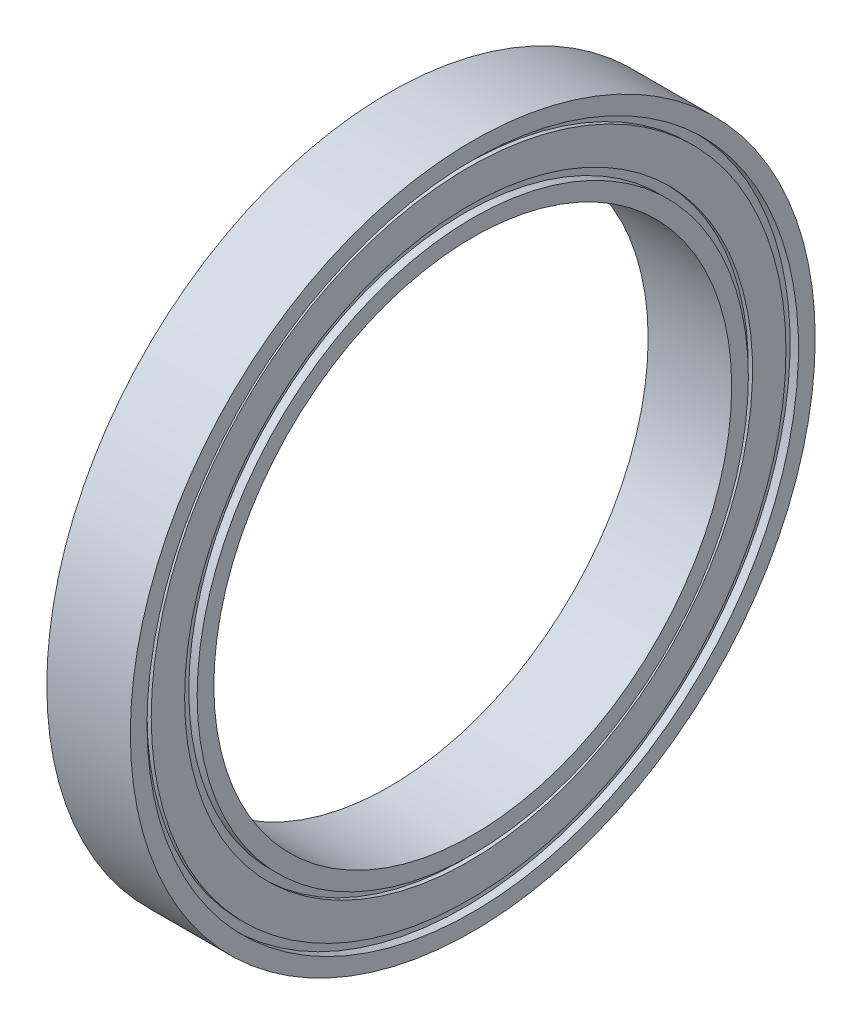
ISO-10303-21;
HEADER;
FILE_DESCRIPTION(('STEP AP214'),'2;1');
FILE_NAME('part.step','',(''),(''),'','','');
FILE_SCHEMA(('AUTOMOTIVE_DESIGN { 1 0 10303 214 1 1 1 1 }'));
ENDSEC;
DATA;
#1=APPLICATION_CONTEXT('core data for automotive mechanical design processes');
#2=APPLICATION_PROTOCOL_DEFINITION('international standard','automotive_design',2000,#1);
#3=PRODUCT_CONTEXT('',#1,'mechanical');
#4=PRODUCT('Part','Part','',(#3));
#5=PRODUCT_RELATED_PRODUCT_CATEGORY('part','',(#4));
#6=PRODUCT_DEFINITION_FORMATION('','',#4);
#7=PRODUCT_DEFINITION_CONTEXT('part definition',#1,'design');
#8=PRODUCT_DEFINITION('design','',#6,#7);
#9=PRODUCT_DEFINITION_SHAPE('','',#8);
#10=(LENGTH_UNIT() NAMED_UNIT(*) SI_UNIT(.MILLI.,.METRE.));
#11=(NAMED_UNIT(*) PLANE_ANGLE_UNIT() SI_UNIT($,.RADIAN.));
#12=(NAMED_UNIT(*) SI_UNIT($,.STERADIAN.) SOLID_ANGLE_UNIT());
#13=UNCERTAINTY_MEASURE_WITH_UNIT(LENGTH_MEASURE(1.E-05),#10,'distance_accuracy_value','');
#14=(GEOMETRIC_REPRESENTATION_CONTEXT(3) GLOBAL_UNCERTAINTY_ASSIGNED_CONTEXT((#13)) GLOBAL_UNIT_ASSIGNED_CONTEXT((#10,
#11,#12)) REPRESENTATION_CONTEXT('',''));
#15=CARTESIAN_POINT('',(0.,0.,0.));
#16=DIRECTION('',(0.,0.,1.));
#17=DIRECTION('',(1.,0.,0.));
#18=AXIS2_PLACEMENT_3D('',#15,#16,#17);
#19=CARTESIAN_POINT('',(4.,39.,0.));
#20=DIRECTION('',(-1.,0.,0.));
#21=DIRECTION('',(0.,0.,1.));
#22=AXIS2_PLACEMENT_3D('',#19,#20,#21);
#23=PLANE('',#22);
#24=CARTESIAN_POINT('',(4.,0.,0.));
#25=DIRECTION('',(-1.,0.,0.));
#26=DIRECTION('',(0.,0.,1.));
#27=AXIS2_PLACEMENT_3D('',#24,#25,#26);
#28=CIRCLE('',#27,39.);
#29=CARTESIAN_POINT('',(4.,0.,39.));
#30=VERTEX_POINT('',#29);
#31=EDGE_CURVE('E10',#30,#30,#28,.T.);
#32=ORIENTED_EDGE('',*,*,#31,.F.);
#33=EDGE_LOOP('',(#32));
#34=FACE_BOUND('',#33,.T.);
#35=CARTESIAN_POINT('',(4.,0.,0.));
#36=DIRECTION('',(-1.,0.,0.));
#37=DIRECTION('',(0.,0.,1.));
#38=AXIS2_PLACEMENT_3D('',#35,#36,#37);
#39=CIRCLE('',#38,38.);
#40=CARTESIAN_POINT('',(4.,0.,38.));
#41=VERTEX_POINT('',#40);
#42=EDGE_CURVE('E107',#41,#41,#39,.T.);
#43=ORIENTED_EDGE('',*,*,#42,.T.);
#44=EDGE_LOOP('',(#43));
#45=FACE_BOUND('',#44,.T.);
#46=ADVANCED_FACE('F43',(#34,#45),#23,.F.);
#47=CARTESIAN_POINT('',(0.,0.,0.));
#48=DIRECTION('',(-1.,0.,0.));
#49=DIRECTION('',(0.,0.,1.));
#50=AXIS2_PLACEMENT_3D('',#47,#48,#49);
#51=CYLINDRICAL_SURFACE('',#50,39.);
#52=CARTESIAN_POINT('',(5.,0.,0.));
#53=DIRECTION('',(-1.,0.,0.));
#54=DIRECTION('',(0.,0.,1.));
#55=AXIS2_PLACEMENT_3D('',#52,#53,#54);
#56=CIRCLE('',#55,39.);
#57=CARTESIAN_POINT('',(5.,0.,39.));
#58=VERTEX_POINT('',#57);
#59=EDGE_CURVE('E49',#58,#58,#56,.T.);
#60=ORIENTED_EDGE('',*,*,#59,.F.);
#61=EDGE_LOOP('',(#60));
#62=FACE_BOUND('',#61,.T.);
#63=ORIENTED_EDGE('',*,*,#31,.T.);
#64=EDGE_LOOP('',(#63));
#65=FACE_BOUND('',#64,.T.);
#66=ADVANCED_FACE('F216',(#62,#65),#51,.F.);
#67=CARTESIAN_POINT('',(5.,41.,0.));
#68=DIRECTION('',(-1.,0.,0.));
#69=DIRECTION('',(0.,0.,1.));
#70=AXIS2_PLACEMENT_3D('',#67,#68,#69);
#71=PLANE('',#70);
#72=CARTESIAN_POINT('',(5.,0.,0.));
#73=DIRECTION('',(-1.,0.,0.));
#74=DIRECTION('',(0.,0.,1.));
#75=AXIS2_PLACEMENT_3D('',#72,#73,#74);
#76=CIRCLE('',#75,41.);
#77=CARTESIAN_POINT('',(5.,0.,41.));
#78=VERTEX_POINT('',#77);
#79=EDGE_CURVE('E53',#78,#78,#76,.T.);
#80=ORIENTED_EDGE('',*,*,#79,.F.);
#81=EDGE_LOOP('',(#80));
#82=FACE_BOUND('',#81,.T.);
#83=ORIENTED_EDGE('',*,*,#59,.T.);
#84=EDGE_LOOP('',(#83));
#85=FACE_BOUND('',#84,.T.);
#86=ADVANCED_FACE('F211',(#82,#85),#71,.F.);
#87=CARTESIAN_POINT('',(0.,0.,0.));
#88=DIRECTION('',(-1.,0.,0.));
#89=DIRECTION('',(0.,0.,1.));
#90=AXIS2_PLACEMENT_3D('',#87,#88,#89);
#91=CYLINDRICAL_SURFACE('',#90,41.);
#92=CARTESIAN_POINT('',(-5.,0.,0.));
#93=DIRECTION('',(-1.,0.,0.));
#94=DIRECTION('',(0.,0.,1.));
#95=AXIS2_PLACEMENT_3D('',#92,#93,#94);
#96=CIRCLE('',#95,41.);
#97=CARTESIAN_POINT('',(-5.,0.,41.));
#98=VERTEX_POINT('',#97);
#99=EDGE_CURVE('E57',#98,#98,#96,.T.);
#100=ORIENTED_EDGE('',*,*,#99,.F.);
#101=EDGE_LOOP('',(#100));
#102=FACE_BOUND('',#101,.T.);
#103=ORIENTED_EDGE('',*,*,#79,.T.);
#104=EDGE_LOOP('',(#103));
#105=FACE_BOUND('',#104,.T.);
#106=ADVANCED_FACE('F205',(#102,#105),#91,.T.);
#107=CARTESIAN_POINT('',(-5.,41.,0.));
#108=DIRECTION('',(1.,0.,0.));
#109=DIRECTION('',(0.,0.,-1.));
#110=AXIS2_PLACEMENT_3D('',#107,#108,#109);
#111=PLANE('',#110);
#112=CARTESIAN_POINT('',(-5.,0.,0.));
#113=DIRECTION('',(-1.,0.,0.));
#114=DIRECTION('',(0.,0.,1.));
#115=AXIS2_PLACEMENT_3D('',#112,#113,#114);
#116=CIRCLE('',#115,39.);
#117=CARTESIAN_POINT('',(-5.,0.,39.));
#118=VERTEX_POINT('',#117);
#119=EDGE_CURVE('E62',#118,#118,#116,.T.);
#120=ORIENTED_EDGE('',*,*,#119,.F.);
#121=EDGE_LOOP('',(#120));
#122=FACE_BOUND('',#121,.T.);
#123=ORIENTED_EDGE('',*,*,#99,.T.);
#124=EDGE_LOOP('',(#123));
#125=FACE_BOUND('',#124,.T.);
#126=ADVANCED_FACE('F199',(#122,#125),#111,.F.);
#127=CARTESIAN_POINT('',(0.,0.,0.));
#128=DIRECTION('',(-1.,0.,0.));
#129=DIRECTION('',(0.,0.,1.));
#130=AXIS2_PLACEMENT_3D('',#127,#128,#129);
#131=CYLINDRICAL_SURFACE('',#130,39.);
#132=CARTESIAN_POINT('',(-4.,0.,0.));
#133=DIRECTION('',(-1.,0.,0.));
#134=DIRECTION('',(0.,0.,1.));
#135=AXIS2_PLACEMENT_3D('',#132,#133,#134);
#136=CIRCLE('',#135,39.);
#137=CARTESIAN_POINT('',(-4.,0.,39.));
#138=VERTEX_POINT('',#137);
#139=EDGE_CURVE('E65',#138,#138,#136,.T.);
#140=ORIENTED_EDGE('',*,*,#139,.F.);
#141=EDGE_LOOP('',(#140));
#142=FACE_BOUND('',#141,.T.);
#143=ORIENTED_EDGE('',*,*,#119,.T.);
#144=EDGE_LOOP('',(#143));
#145=FACE_BOUND('',#144,.T.);
#146=ADVANCED_FACE('F193',(#142,#145),#131,.F.);
#147=CARTESIAN_POINT('',(-4.,39.,0.));
#148=DIRECTION('',(1.,0.,0.));
#149=DIRECTION('',(0.,0.,-1.));
#150=AXIS2_PLACEMENT_3D('',#147,#148,#149);
#151=PLANE('',#150);
#152=CARTESIAN_POINT('',(-4.,0.,0.));
#153=DIRECTION('',(-1.,0.,0.));
#154=DIRECTION('',(0.,0.,1.));
#155=AXIS2_PLACEMENT_3D('',#152,#153,#154);
#156=CIRCLE('',#155,38.);
#157=CARTESIAN_POINT('',(-4.,0.,38.));
#158=VERTEX_POINT('',#157);
#159=EDGE_CURVE('E68',#158,#158,#156,.T.);
#160=ORIENTED_EDGE('',*,*,#159,.F.);
#161=EDGE_LOOP('',(#160));
#162=FACE_BOUND('',#161,.T.);
#163=ORIENTED_EDGE('',*,*,#139,.T.);
#164=EDGE_LOOP('',(#163));
#165=FACE_BOUND('',#164,.T.);
#166=ADVANCED_FACE('F187',(#162,#165),#151,.F.);
#167=CARTESIAN_POINT('',(0.,0.,0.));
#168=DIRECTION('',(-1.,0.,0.));
#169=DIRECTION('',(0.,0.,1.));
#170=AXIS2_PLACEMENT_3D('',#167,#168,#169);
#171=CYLINDRICAL_SURFACE('',#170,38.);
#172=CARTESIAN_POINT('',(-4.5,0.,0.));
#173=DIRECTION('',(-1.,0.,0.));
#174=DIRECTION('',(0.,0.,1.));
#175=AXIS2_PLACEMENT_3D('',#172,#173,#174);
#176=CIRCLE('',#175,38.);
#177=CARTESIAN_POINT('',(-4.5,0.,38.));
#178=VERTEX_POINT('',#177);
#179=EDGE_CURVE('E71',#178,#178,#176,.T.);
#180=ORIENTED_EDGE('',*,*,#179,.F.);
#181=EDGE_LOOP('',(#180));
#182=FACE_BOUND('',#181,.T.);
#183=ORIENTED_EDGE('',*,*,#159,.T.);
#184=EDGE_LOOP('',(#183));
#185=FACE_BOUND('',#184,.T.);
#186=ADVANCED_FACE('F181',(#182,#185),#171,.T.);
#187=CARTESIAN_POINT('',(-4.5,38.,0.));
#188=DIRECTION('',(1.,0.,0.));
#189=DIRECTION('',(0.,0.,-1.));
#190=AXIS2_PLACEMENT_3D('',#187,#188,#189);
#191=PLANE('',#190);
#192=CARTESIAN_POINT('',(-4.5,0.,0.));
#193=DIRECTION('',(-1.,0.,0.));
#194=DIRECTION('',(0.,0.,1.));
#195=AXIS2_PLACEMENT_3D('',#192,#193,#194);
#196=CIRCLE('',#195,34.);
#197=CARTESIAN_POINT('',(-4.5,0.,34.));
#198=VERTEX_POINT('',#197);
#199=EDGE_CURVE('E74',#198,#198,#196,.T.);
#200=ORIENTED_EDGE('',*,*,#199,.F.);
#201=EDGE_LOOP('',(#200));
#202=FACE_BOUND('',#201,.T.);
#203=ORIENTED_EDGE('',*,*,#179,.T.);
#204=EDGE_LOOP('',(#203));
#205=FACE_BOUND('',#204,.T.);
#206=ADVANCED_FACE('F175',(#202,#205),#191,.F.);
#207=CARTESIAN_POINT('',(0.,0.,0.));
#208=DIRECTION('',(-1.,0.,0.));
#209=DIRECTION('',(0.,0.,1.));
#210=AXIS2_PLACEMENT_3D('',#207,#208,#209);
#211=CYLINDRICAL_SURFACE('',#210,34.);
#212=CARTESIAN_POINT('',(-4.,0.,0.));
#213=DIRECTION('',(-1.,0.,0.));
#214=DIRECTION('',(0.,0.,1.));
#215=AXIS2_PLACEMENT_3D('',#212,#213,#214);
#216=CIRCLE('',#215,34.);
#217=CARTESIAN_POINT('',(-4.,0.,34.));
#218=VERTEX_POINT('',#217);
#219=EDGE_CURVE('E77',#218,#218,#216,.T.);
#220=ORIENTED_EDGE('',*,*,#219,.F.);
#221=EDGE_LOOP('',(#220));
#222=FACE_BOUND('',#221,.T.);
#223=ORIENTED_EDGE('',*,*,#199,.T.);
#224=EDGE_LOOP('',(#223));
#225=FACE_BOUND('',#224,.T.);
#226=ADVANCED_FACE('F169',(#222,#225),#211,.F.);
#227=CARTESIAN_POINT('',(-4.,33.,0.));
#228=DIRECTION('',(1.,0.,0.));
#229=DIRECTION('',(0.,0.,-1.));
#230=AXIS2_PLACEMENT_3D('',#227,#228,#229);
#231=PLANE('',#230);
#232=CARTESIAN_POINT('',(-4.,0.,0.));
#233=DIRECTION('',(-1.,0.,0.));
#234=DIRECTION('',(0.,0.,1.));
#235=AXIS2_PLACEMENT_3D('',#232,#233,#234);
#236=CIRCLE('',#235,33.);
#237=CARTESIAN_POINT('',(-4.,0.,33.));
#238=VERTEX_POINT('',#237);
#239=EDGE_CURVE('E80',#238,#238,#236,.T.);
#240=ORIENTED_EDGE('',*,*,#239,.F.);
#241=EDGE_LOOP('',(#240));
#242=FACE_BOUND('',#241,.T.);
#243=ORIENTED_EDGE('',*,*,#219,.T.);
#244=EDGE_LOOP('',(#243));
#245=FACE_BOUND('',#244,.T.);
#246=ADVANCED_FACE('F163',(#242,#245),#231,.F.);
#247=CARTESIAN_POINT('',(0.,0.,0.));
#248=DIRECTION('',(-1.,0.,0.));
#249=DIRECTION('',(0.,0.,1.));
#250=AXIS2_PLACEMENT_3D('',#247,#248,#249);
#251=CYLINDRICAL_SURFACE('',#250,33.);
#252=CARTESIAN_POINT('',(-5.,0.,0.));
#253=DIRECTION('',(-1.,0.,0.));
#254=DIRECTION('',(0.,0.,1.));
#255=AXIS2_PLACEMENT_3D('',#252,#253,#254);
#256=CIRCLE('',#255,33.);
#257=CARTESIAN_POINT('',(-5.,0.,33.));
#258=VERTEX_POINT('',#257);
#259=EDGE_CURVE('E83',#258,#258,#256,.T.);
#260=ORIENTED_EDGE('',*,*,#259,.F.);
#261=EDGE_LOOP('',(#260));
#262=FACE_BOUND('',#261,.T.);
#263=ORIENTED_EDGE('',*,*,#239,.T.);
#264=EDGE_LOOP('',(#263));
#265=FACE_BOUND('',#264,.T.);
#266=ADVANCED_FACE('F157',(#262,#265),#251,.T.);
#267=CARTESIAN_POINT('',(-5.,31.,0.));
#268=DIRECTION('',(1.,0.,0.));
#269=DIRECTION('',(0.,0.,-1.));
#270=AXIS2_PLACEMENT_3D('',#267,#268,#269);
#271=PLANE('',#270);
#272=CARTESIAN_POINT('',(-5.,0.,0.));
#273=DIRECTION('',(-1.,0.,0.));
#274=DIRECTION('',(0.,0.,1.));
#275=AXIS2_PLACEMENT_3D('',#272,#273,#274);
#276=CIRCLE('',#275,31.);
#277=CARTESIAN_POINT('',(-5.,0.,31.));
#278=VERTEX_POINT('',#277);
#279=EDGE_CURVE('E86',#278,#278,#276,.T.);
#280=ORIENTED_EDGE('',*,*,#279,.F.);
#281=EDGE_LOOP('',(#280));
#282=FACE_BOUND('',#281,.T.);
#283=ORIENTED_EDGE('',*,*,#259,.T.);
#284=EDGE_LOOP('',(#283));
#285=FACE_BOUND('',#284,.T.);
#286=ADVANCED_FACE('F151',(#282,#285),#271,.F.);
#287=CARTESIAN_POINT('',(0.,0.,0.));
#288=DIRECTION('',(-1.,0.,0.));
#289=DIRECTION('',(0.,0.,1.));
#290=AXIS2_PLACEMENT_3D('',#287,#288,#289);
#291=CYLINDRICAL_SURFACE('',#290,31.);
#292=CARTESIAN_POINT('',(5.,0.,0.));
#293=DIRECTION('',(-1.,0.,0.));
#294=DIRECTION('',(0.,0.,1.));
#295=AXIS2_PLACEMENT_3D('',#292,#293,#294);
#296=CIRCLE('',#295,31.);
#297=CARTESIAN_POINT('',(5.,0.,31.));
#298=VERTEX_POINT('',#297);
#299=EDGE_CURVE('E89',#298,#298,#296,.T.);
#300=ORIENTED_EDGE('',*,*,#299,.F.);
#301=EDGE_LOOP('',(#300));
#302=FACE_BOUND('',#301,.T.);
#303=ORIENTED_EDGE('',*,*,#279,.T.);
#304=EDGE_LOOP('',(#303));
#305=FACE_BOUND('',#304,.T.);
#306=ADVANCED_FACE('F145',(#302,#305),#291,.F.);
#307=CARTESIAN_POINT('',(5.,31.,0.));
#308=DIRECTION('',(-1.,0.,0.));
#309=DIRECTION('',(0.,0.,1.));
#310=AXIS2_PLACEMENT_3D('',#307,#308,#309);
#311=PLANE('',#310);
#312=CARTESIAN_POINT('',(5.,0.,0.));
#313=DIRECTION('',(-1.,0.,0.));
#314=DIRECTION('',(0.,0.,1.));
#315=AXIS2_PLACEMENT_3D('',#312,#313,#314);
#316=CIRCLE('',#315,33.);
#317=CARTESIAN_POINT('',(5.,0.,33.));
#318=VERTEX_POINT('',#317);
#319=EDGE_CURVE('E92',#318,#318,#316,.T.);
#320=ORIENTED_EDGE('',*,*,#319,.F.);
#321=EDGE_LOOP('',(#320));
#322=FACE_BOUND('',#321,.T.);
#323=ORIENTED_EDGE('',*,*,#299,.T.);
#324=EDGE_LOOP('',(#323));
#325=FACE_BOUND('',#324,.T.);
#326=ADVANCED_FACE('F139',(#322,#325),#311,.F.);
#327=CARTESIAN_POINT('',(0.,0.,0.));
#328=DIRECTION('',(-1.,0.,0.));
#329=DIRECTION('',(0.,0.,1.));
#330=AXIS2_PLACEMENT_3D('',#327,#328,#329);
#331=CYLINDRICAL_SURFACE('',#330,33.);
#332=CARTESIAN_POINT('',(4.,0.,0.));
#333=DIRECTION('',(-1.,0.,0.));
#334=DIRECTION('',(0.,0.,1.));
#335=AXIS2_PLACEMENT_3D('',#332,#333,#334);
#336=CIRCLE('',#335,33.);
#337=CARTESIAN_POINT('',(4.,0.,33.));
#338=VERTEX_POINT('',#337);
#339=EDGE_CURVE('E95',#338,#338,#336,.T.);
#340=ORIENTED_EDGE('',*,*,#339,.F.);
#341=EDGE_LOOP('',(#340));
#342=FACE_BOUND('',#341,.T.);
#343=ORIENTED_EDGE('',*,*,#319,.T.);
#344=EDGE_LOOP('',(#343));
#345=FACE_BOUND('',#344,.T.);
#346=ADVANCED_FACE('F133',(#342,#345),#331,.T.);
#347=CARTESIAN_POINT('',(4.,33.,0.));
#348=DIRECTION('',(-1.,0.,0.));
#349=DIRECTION('',(0.,0.,1.));
#350=AXIS2_PLACEMENT_3D('',#347,#348,#349);
#351=PLANE('',#350);
#352=CARTESIAN_POINT('',(4.,0.,0.));
#353=DIRECTION('',(-1.,0.,0.));
#354=DIRECTION('',(0.,0.,1.));
#355=AXIS2_PLACEMENT_3D('',#352,#353,#354);
#356=CIRCLE('',#355,34.);
#357=CARTESIAN_POINT('',(4.,0.,34.));
#358=VERTEX_POINT('',#357);
#359=EDGE_CURVE('E98',#358,#358,#356,.T.);
#360=ORIENTED_EDGE('',*,*,#359,.F.);
#361=EDGE_LOOP('',(#360));
#362=FACE_BOUND('',#361,.T.);
#363=ORIENTED_EDGE('',*,*,#339,.T.);
#364=EDGE_LOOP('',(#363));
#365=FACE_BOUND('',#364,.T.);
#366=ADVANCED_FACE('F127',(#362,#365),#351,.F.);
#367=CARTESIAN_POINT('',(0.,0.,0.));
#368=DIRECTION('',(-1.,0.,0.));
#369=DIRECTION('',(0.,0.,1.));
#370=AXIS2_PLACEMENT_3D('',#367,#368,#369);
#371=CYLINDRICAL_SURFACE('',#370,34.);
#372=CARTESIAN_POINT('',(4.5,0.,0.));
#373=DIRECTION('',(-1.,0.,0.));
#374=DIRECTION('',(0.,0.,1.));
#375=AXIS2_PLACEMENT_3D('',#372,#373,#374);
#376=CIRCLE('',#375,34.);
#377=CARTESIAN_POINT('',(4.5,0.,34.));
#378=VERTEX_POINT('',#377);
#379=EDGE_CURVE('E101',#378,#378,#376,.T.);
#380=ORIENTED_EDGE('',*,*,#379,.F.);
#381=EDGE_LOOP('',(#380));
#382=FACE_BOUND('',#381,.T.);
#383=ORIENTED_EDGE('',*,*,#359,.T.);
#384=EDGE_LOOP('',(#383));
#385=FACE_BOUND('',#384,.T.);
#386=ADVANCED_FACE('F121',(#382,#385),#371,.F.);
#387=CARTESIAN_POINT('',(4.5,38.,0.));
#388=DIRECTION('',(-1.,0.,0.));
#389=DIRECTION('',(0.,0.,1.));
#390=AXIS2_PLACEMENT_3D('',#387,#388,#389);
#391=PLANE('',#390);
#392=CARTESIAN_POINT('',(4.5,0.,0.));
#393=DIRECTION('',(-1.,0.,0.));
#394=DIRECTION('',(0.,0.,1.));
#395=AXIS2_PLACEMENT_3D('',#392,#393,#394);
#396=CIRCLE('',#395,38.);
#397=CARTESIAN_POINT('',(4.5,0.,38.));
#398=VERTEX_POINT('',#397);
#399=EDGE_CURVE('E104',#398,#398,#396,.T.);
#400=ORIENTED_EDGE('',*,*,#399,.F.);
#401=EDGE_LOOP('',(#400));
#402=FACE_BOUND('',#401,.T.);
#403=ORIENTED_EDGE('',*,*,#379,.T.);
#404=EDGE_LOOP('',(#403));
#405=FACE_BOUND('',#404,.T.);
#406=ADVANCED_FACE('F115',(#402,#405),#391,.F.);
#407=CARTESIAN_POINT('',(0.,0.,0.));
#408=DIRECTION('',(-1.,0.,0.));
#409=DIRECTION('',(0.,0.,1.));
#410=AXIS2_PLACEMENT_3D('',#407,#408,#409);
#411=CYLINDRICAL_SURFACE('',#410,38.);
#412=ORIENTED_EDGE('',*,*,#42,.F.);
#413=EDGE_LOOP('',(#412));
#414=FACE_BOUND('',#413,.T.);
#415=ORIENTED_EDGE('',*,*,#399,.T.);
#416=EDGE_LOOP('',(#415));
#417=FACE_BOUND('',#416,.T.);
#418=ADVANCED_FACE('F112',(#414,#417),#411,.T.);
#419=CLOSED_SHELL('',(#46,#66,#86,#106,#126,#146,#166,#186,#206,#226,#246,#266,#286,#306,#326,
#346,#366,#386,#406,#418));
#420=MANIFOLD_SOLID_BREP('B2',#419);
#421=ADVANCED_BREP_SHAPE_REPRESENTATION('',(#18,#420),#14);
#422=SHAPE_DEFINITION_REPRESENTATION(#9,#421);
ENDSEC;
END-ISO-10303-21;
